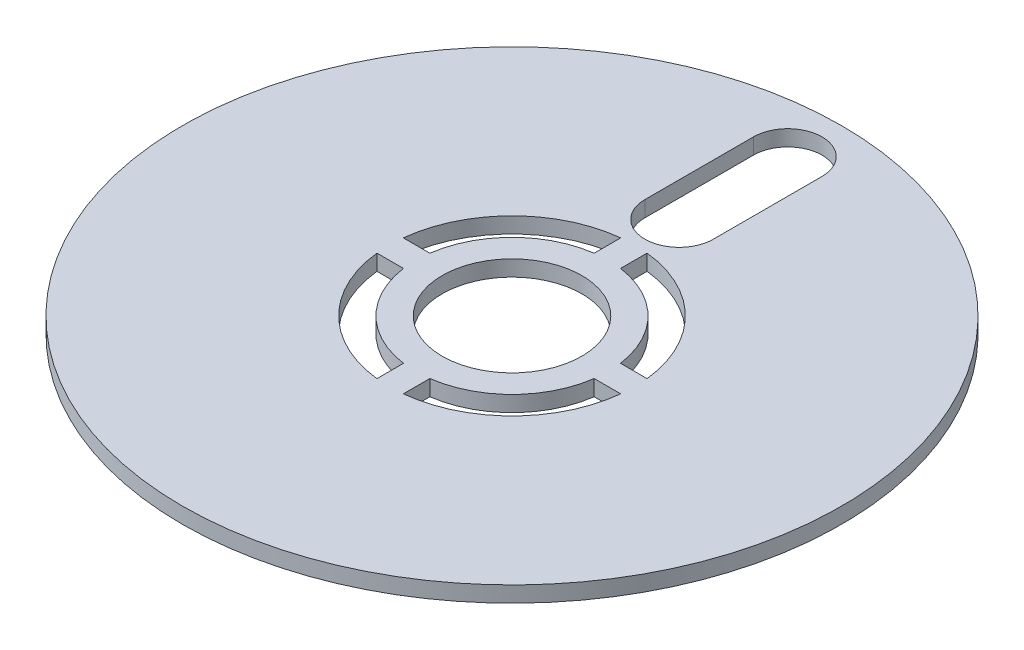
ISO-10303-21;
HEADER;
FILE_DESCRIPTION(('STEP AP214'),'2;1');
FILE_NAME('part.step','',(''),(''),'','','');
FILE_SCHEMA(('AUTOMOTIVE_DESIGN { 1 0 10303 214 1 1 1 1 }'));
ENDSEC;
DATA;
#1=APPLICATION_CONTEXT('core data for automotive mechanical design processes');
#2=APPLICATION_PROTOCOL_DEFINITION('international standard','automotive_design',2000,#1);
#3=PRODUCT_CONTEXT('',#1,'mechanical');
#4=PRODUCT('Part','Part','',(#3));
#5=PRODUCT_RELATED_PRODUCT_CATEGORY('part','',(#4));
#6=PRODUCT_DEFINITION_FORMATION('','',#4);
#7=PRODUCT_DEFINITION_CONTEXT('part definition',#1,'design');
#8=PRODUCT_DEFINITION('design','',#6,#7);
#9=PRODUCT_DEFINITION_SHAPE('','',#8);
#10=(LENGTH_UNIT() NAMED_UNIT(*) SI_UNIT(.MILLI.,.METRE.));
#11=(NAMED_UNIT(*) PLANE_ANGLE_UNIT() SI_UNIT($,.RADIAN.));
#12=(NAMED_UNIT(*) SI_UNIT($,.STERADIAN.) SOLID_ANGLE_UNIT());
#13=UNCERTAINTY_MEASURE_WITH_UNIT(LENGTH_MEASURE(1.E-05),#10,'distance_accuracy_value','');
#14=(GEOMETRIC_REPRESENTATION_CONTEXT(3) GLOBAL_UNCERTAINTY_ASSIGNED_CONTEXT((#13)) GLOBAL_UNIT_ASSIGNED_CONTEXT((#10,
#11,#12)) REPRESENTATION_CONTEXT('',''));
#15=CARTESIAN_POINT('',(0.,0.,0.));
#16=DIRECTION('',(0.,0.,1.));
#17=DIRECTION('',(1.,0.,0.));
#18=AXIS2_PLACEMENT_3D('',#15,#16,#17);
#19=CARTESIAN_POINT('',(0.,3.,0.));
#20=DIRECTION('',(0.,1.,0.));
#21=DIRECTION('',(0.,0.,1.));
#22=AXIS2_PLACEMENT_3D('',#19,#20,#21);
#23=PLANE('',#22);
#24=CARTESIAN_POINT('',(0.,3.,-31.7));
#25=DIRECTION('',(0.,1.,0.));
#26=DIRECTION('',(0.,0.,1.));
#27=AXIS2_PLACEMENT_3D('',#24,#25,#26);
#28=CIRCLE('',#27,6.5);
#29=CARTESIAN_POINT('',(-6.5,3.,-31.7));
#30=VERTEX_POINT('',#29);
#31=CARTESIAN_POINT('',(6.5,3.,-31.7));
#32=VERTEX_POINT('',#31);
#33=EDGE_CURVE('E52',#30,#32,#28,.T.);
#34=ORIENTED_EDGE('',*,*,#33,.F.);
#35=DIRECTION('',(0.,0.,1.));
#36=VECTOR('',#35,1.);
#37=CARTESIAN_POINT('',(-6.5,3.,-31.7));
#38=LINE('',#37,#36);
#39=CARTESIAN_POINT('',(-6.50000000000001,3.,-52.3));
#40=VERTEX_POINT('',#39);
#41=EDGE_CURVE('E192',#40,#30,#38,.T.);
#42=ORIENTED_EDGE('',*,*,#41,.F.);
#43=CARTESIAN_POINT('',(0.,3.,-52.3));
#44=DIRECTION('',(0.,1.,0.));
#45=DIRECTION('',(0.,0.,1.));
#46=AXIS2_PLACEMENT_3D('',#43,#44,#45);
#47=CIRCLE('',#46,6.5);
#48=CARTESIAN_POINT('',(6.5,3.,-52.3));
#49=VERTEX_POINT('',#48);
#50=EDGE_CURVE('E195',#49,#40,#47,.T.);
#51=ORIENTED_EDGE('',*,*,#50,.F.);
#52=DIRECTION('',(0.,0.,-1.));
#53=VECTOR('',#52,1.);
#54=CARTESIAN_POINT('',(6.5,3.,-31.7));
#55=LINE('',#54,#53);
#56=EDGE_CURVE('E201',#32,#49,#55,.T.);
#57=ORIENTED_EDGE('',*,*,#56,.F.);
#58=EDGE_LOOP('',(#34,#42,#51,#57));
#59=FACE_BOUND('',#58,.T.);
#60=CARTESIAN_POINT('',(0.,3.,0.));
#61=DIRECTION('',(0.,1.,0.));
#62=DIRECTION('',(0.,0.,1.));
#63=AXIS2_PLACEMENT_3D('',#60,#61,#62);
#64=CIRCLE('',#63,62.5);
#65=CARTESIAN_POINT('',(0.,3.,62.5));
#66=VERTEX_POINT('',#65);
#67=EDGE_CURVE('E11',#66,#66,#64,.T.);
#68=ORIENTED_EDGE('',*,*,#67,.T.);
#69=EDGE_LOOP('',(#68));
#70=FACE_BOUND('',#69,.T.);
#71=CARTESIAN_POINT('',(0.,3.,0.));
#72=DIRECTION('',(0.,1.,0.));
#73=DIRECTION('',(0.,0.,1.));
#74=AXIS2_PLACEMENT_3D('',#71,#72,#73);
#75=CIRCLE('',#74,13.25);
#76=CARTESIAN_POINT('',(0.,3.,13.25));
#77=VERTEX_POINT('',#76);
#78=EDGE_CURVE('E335',#77,#77,#75,.T.);
#79=ORIENTED_EDGE('',*,*,#78,.F.);
#80=EDGE_LOOP('',(#79));
#81=FACE_BOUND('',#80,.T.);
#82=DIRECTION('',(0.,0.,-1.));
#83=VECTOR('',#82,1.);
#84=CARTESIAN_POINT('',(-2.5,3.,-18.0779561897909));
#85=LINE('',#84,#83);
#86=CARTESIAN_POINT('',(-2.5,3.,-18.0779561897909));
#87=VERTEX_POINT('',#86);
#88=CARTESIAN_POINT('',(-2.5,3.,-23.1152006264276));
#89=VERTEX_POINT('',#88);
#90=EDGE_CURVE('E306',#87,#89,#85,.T.);
#91=ORIENTED_EDGE('',*,*,#90,.F.);
#92=CARTESIAN_POINT('',(0.,3.,0.));
#93=DIRECTION('',(0.,-1.,0.));
#94=DIRECTION('',(0.,0.,1.));
#95=AXIS2_PLACEMENT_3D('',#92,#93,#94);
#96=CIRCLE('',#95,18.25);
#97=CARTESIAN_POINT('',(-18.0779561897909,3.,-2.5));
#98=VERTEX_POINT('',#97);
#99=EDGE_CURVE('E304',#98,#87,#96,.T.);
#100=ORIENTED_EDGE('',*,*,#99,.F.);
#101=DIRECTION('',(1.,0.,0.));
#102=VECTOR('',#101,1.);
#103=CARTESIAN_POINT('',(-18.0779561897909,3.,-2.5));
#104=LINE('',#103,#102);
#105=CARTESIAN_POINT('',(-23.1152006264276,3.,-2.5));
#106=VERTEX_POINT('',#105);
#107=EDGE_CURVE('E312',#106,#98,#104,.T.);
#108=ORIENTED_EDGE('',*,*,#107,.F.);
#109=CARTESIAN_POINT('',(0.,3.,0.));
#110=DIRECTION('',(0.,1.,0.));
#111=DIRECTION('',(0.,0.,1.));
#112=AXIS2_PLACEMENT_3D('',#109,#110,#111);
#113=CIRCLE('',#112,23.25);
#114=EDGE_CURVE('E309',#89,#106,#113,.T.);
#115=ORIENTED_EDGE('',*,*,#114,.F.);
#116=EDGE_LOOP('',(#91,#100,#108,#115));
#117=FACE_BOUND('',#116,.T.);
#118=DIRECTION('',(1.,0.,0.));
#119=VECTOR('',#118,1.);
#120=CARTESIAN_POINT('',(18.0779561897909,3.,-2.5));
#121=LINE('',#120,#119);
#122=CARTESIAN_POINT('',(18.0779561897909,3.,-2.5));
#123=VERTEX_POINT('',#122);
#124=CARTESIAN_POINT('',(23.1152006264276,3.,-2.5));
#125=VERTEX_POINT('',#124);
#126=EDGE_CURVE('E275',#123,#125,#121,.T.);
#127=ORIENTED_EDGE('',*,*,#126,.F.);
#128=CARTESIAN_POINT('',(0.,3.,0.));
#129=DIRECTION('',(0.,-1.,0.));
#130=DIRECTION('',(0.,0.,1.));
#131=AXIS2_PLACEMENT_3D('',#128,#129,#130);
#132=CIRCLE('',#131,18.25);
#133=CARTESIAN_POINT('',(2.5,3.,-18.0779561897909));
#134=VERTEX_POINT('',#133);
#135=EDGE_CURVE('E273',#134,#123,#132,.T.);
#136=ORIENTED_EDGE('',*,*,#135,.F.);
#137=DIRECTION('',(0.,0.,1.));
#138=VECTOR('',#137,1.);
#139=CARTESIAN_POINT('',(2.5,3.,-18.0779561897909));
#140=LINE('',#139,#138);
#141=CARTESIAN_POINT('',(2.5,3.,-23.1152006264276));
#142=VERTEX_POINT('',#141);
#143=EDGE_CURVE('E281',#142,#134,#140,.T.);
#144=ORIENTED_EDGE('',*,*,#143,.F.);
#145=CARTESIAN_POINT('',(0.,3.,0.));
#146=DIRECTION('',(0.,1.,0.));
#147=DIRECTION('',(0.,0.,1.));
#148=AXIS2_PLACEMENT_3D('',#145,#146,#147);
#149=CIRCLE('',#148,23.25);
#150=EDGE_CURVE('E278',#125,#142,#149,.T.);
#151=ORIENTED_EDGE('',*,*,#150,.F.);
#152=EDGE_LOOP('',(#127,#136,#144,#151));
#153=FACE_BOUND('',#152,.T.);
#154=DIRECTION('',(0.,0.,1.));
#155=VECTOR('',#154,1.);
#156=CARTESIAN_POINT('',(2.5,3.,18.0779561897909));
#157=LINE('',#156,#155);
#158=CARTESIAN_POINT('',(2.5,3.,18.0779561897909));
#159=VERTEX_POINT('',#158);
#160=CARTESIAN_POINT('',(2.5,3.,23.1152006264276));
#161=VERTEX_POINT('',#160);
#162=EDGE_CURVE('E244',#159,#161,#157,.T.);
#163=ORIENTED_EDGE('',*,*,#162,.F.);
#164=CARTESIAN_POINT('',(0.,3.,0.));
#165=DIRECTION('',(0.,-1.,0.));
#166=DIRECTION('',(0.,0.,1.));
#167=AXIS2_PLACEMENT_3D('',#164,#165,#166);
#168=CIRCLE('',#167,18.25);
#169=CARTESIAN_POINT('',(18.0779561897909,3.,2.5));
#170=VERTEX_POINT('',#169);
#171=EDGE_CURVE('E242',#170,#159,#168,.T.);
#172=ORIENTED_EDGE('',*,*,#171,.F.);
#173=DIRECTION('',(-1.,0.,0.));
#174=VECTOR('',#173,1.);
#175=CARTESIAN_POINT('',(18.0779561897909,3.,2.5));
#176=LINE('',#175,#174);
#177=CARTESIAN_POINT('',(23.1152006264276,3.,2.5));
#178=VERTEX_POINT('',#177);
#179=EDGE_CURVE('E250',#178,#170,#176,.T.);
#180=ORIENTED_EDGE('',*,*,#179,.F.);
#181=CARTESIAN_POINT('',(0.,3.,0.));
#182=DIRECTION('',(0.,1.,0.));
#183=DIRECTION('',(0.,0.,1.));
#184=AXIS2_PLACEMENT_3D('',#181,#182,#183);
#185=CIRCLE('',#184,23.25);
#186=EDGE_CURVE('E247',#161,#178,#185,.T.);
#187=ORIENTED_EDGE('',*,*,#186,.F.);
#188=EDGE_LOOP('',(#163,#172,#180,#187));
#189=FACE_BOUND('',#188,.T.);
#190=DIRECTION('',(-1.,0.,0.));
#191=VECTOR('',#190,1.);
#192=CARTESIAN_POINT('',(-18.0779561897909,3.,2.5));
#193=LINE('',#192,#191);
#194=CARTESIAN_POINT('',(-18.0779561897909,3.,2.5));
#195=VERTEX_POINT('',#194);
#196=CARTESIAN_POINT('',(-23.1152006264276,3.,2.50000000000001));
#197=VERTEX_POINT('',#196);
#198=EDGE_CURVE('E213',#195,#197,#193,.T.);
#199=ORIENTED_EDGE('',*,*,#198,.F.);
#200=CARTESIAN_POINT('',(0.,3.,0.));
#201=DIRECTION('',(0.,-1.,0.));
#202=DIRECTION('',(0.,0.,1.));
#203=AXIS2_PLACEMENT_3D('',#200,#201,#202);
#204=CIRCLE('',#203,18.25);
#205=CARTESIAN_POINT('',(-2.5,3.,18.0779561897909));
#206=VERTEX_POINT('',#205);
#207=EDGE_CURVE('E211',#206,#195,#204,.T.);
#208=ORIENTED_EDGE('',*,*,#207,.F.);
#209=DIRECTION('',(0.,0.,-1.));
#210=VECTOR('',#209,1.);
#211=CARTESIAN_POINT('',(-2.5,3.,18.0779561897909));
#212=LINE('',#211,#210);
#213=CARTESIAN_POINT('',(-2.5,3.,23.1152006264276));
#214=VERTEX_POINT('',#213);
#215=EDGE_CURVE('E219',#214,#206,#212,.T.);
#216=ORIENTED_EDGE('',*,*,#215,.F.);
#217=CARTESIAN_POINT('',(0.,3.,0.));
#218=DIRECTION('',(0.,1.,0.));
#219=DIRECTION('',(0.,0.,1.));
#220=AXIS2_PLACEMENT_3D('',#217,#218,#219);
#221=CIRCLE('',#220,23.25);
#222=EDGE_CURVE('E216',#197,#214,#221,.T.);
#223=ORIENTED_EDGE('',*,*,#222,.F.);
#224=EDGE_LOOP('',(#199,#208,#216,#223));
#225=FACE_BOUND('',#224,.T.);
#226=ADVANCED_FACE('F37',(#59,#70,#81,#117,#153,#189,#225),#23,.T.);
#227=CARTESIAN_POINT('',(0.,0.,0.));
#228=DIRECTION('',(0.,1.,0.));
#229=DIRECTION('',(0.,0.,1.));
#230=AXIS2_PLACEMENT_3D('',#227,#228,#229);
#231=PLANE('',#230);
#232=DIRECTION('',(0.,0.,1.));
#233=VECTOR('',#232,1.);
#234=CARTESIAN_POINT('',(-6.5,0.,-31.7));
#235=LINE('',#234,#233);
#236=CARTESIAN_POINT('',(-6.50000000000001,0.,-52.3));
#237=VERTEX_POINT('',#236);
#238=CARTESIAN_POINT('',(-6.5,0.,-31.7));
#239=VERTEX_POINT('',#238);
#240=EDGE_CURVE('E182',#237,#239,#235,.T.);
#241=ORIENTED_EDGE('',*,*,#240,.T.);
#242=CARTESIAN_POINT('',(0.,0.,-31.7));
#243=DIRECTION('',(0.,1.,0.));
#244=DIRECTION('',(0.,0.,1.));
#245=AXIS2_PLACEMENT_3D('',#242,#243,#244);
#246=CIRCLE('',#245,6.5);
#247=CARTESIAN_POINT('',(6.5,0.,-31.7));
#248=VERTEX_POINT('',#247);
#249=EDGE_CURVE('E176',#239,#248,#246,.T.);
#250=ORIENTED_EDGE('',*,*,#249,.T.);
#251=DIRECTION('',(0.,0.,-1.));
#252=VECTOR('',#251,1.);
#253=CARTESIAN_POINT('',(6.5,0.,-31.7));
#254=LINE('',#253,#252);
#255=CARTESIAN_POINT('',(6.5,0.,-52.3));
#256=VERTEX_POINT('',#255);
#257=EDGE_CURVE('E185',#248,#256,#254,.T.);
#258=ORIENTED_EDGE('',*,*,#257,.T.);
#259=CARTESIAN_POINT('',(0.,0.,-52.3));
#260=DIRECTION('',(0.,1.,0.));
#261=DIRECTION('',(0.,0.,1.));
#262=AXIS2_PLACEMENT_3D('',#259,#260,#261);
#263=CIRCLE('',#262,6.5);
#264=EDGE_CURVE('E60',#256,#237,#263,.T.);
#265=ORIENTED_EDGE('',*,*,#264,.T.);
#266=EDGE_LOOP('',(#241,#250,#258,#265));
#267=FACE_BOUND('',#266,.T.);
#268=CARTESIAN_POINT('',(0.,0.,0.));
#269=DIRECTION('',(0.,-1.,0.));
#270=DIRECTION('',(0.,0.,1.));
#271=AXIS2_PLACEMENT_3D('',#268,#269,#270);
#272=CIRCLE('',#271,18.25);
#273=CARTESIAN_POINT('',(18.0779561897909,0.,2.5));
#274=VERTEX_POINT('',#273);
#275=CARTESIAN_POINT('',(2.5,0.,18.0779561897909));
#276=VERTEX_POINT('',#275);
#277=EDGE_CURVE('E241',#274,#276,#272,.T.);
#278=ORIENTED_EDGE('',*,*,#277,.T.);
#279=DIRECTION('',(0.,0.,1.));
#280=VECTOR('',#279,1.);
#281=CARTESIAN_POINT('',(2.5,0.,18.0779561897909));
#282=LINE('',#281,#280);
#283=CARTESIAN_POINT('',(2.5,0.,23.1152006264276));
#284=VERTEX_POINT('',#283);
#285=EDGE_CURVE('E255',#276,#284,#282,.T.);
#286=ORIENTED_EDGE('',*,*,#285,.T.);
#287=CARTESIAN_POINT('',(0.,0.,0.));
#288=DIRECTION('',(0.,1.,0.));
#289=DIRECTION('',(0.,0.,1.));
#290=AXIS2_PLACEMENT_3D('',#287,#288,#289);
#291=CIRCLE('',#290,23.25);
#292=CARTESIAN_POINT('',(23.1152006264276,0.,2.5));
#293=VERTEX_POINT('',#292);
#294=EDGE_CURVE('E258',#284,#293,#291,.T.);
#295=ORIENTED_EDGE('',*,*,#294,.T.);
#296=DIRECTION('',(-1.,0.,0.));
#297=VECTOR('',#296,1.);
#298=CARTESIAN_POINT('',(18.0779561897909,0.,2.5));
#299=LINE('',#298,#297);
#300=EDGE_CURVE('E245',#293,#274,#299,.T.);
#301=ORIENTED_EDGE('',*,*,#300,.T.);
#302=EDGE_LOOP('',(#278,#286,#295,#301));
#303=FACE_BOUND('',#302,.T.);
#304=CARTESIAN_POINT('',(0.,0.,0.));
#305=DIRECTION('',(0.,-1.,0.));
#306=DIRECTION('',(0.,0.,1.));
#307=AXIS2_PLACEMENT_3D('',#304,#305,#306);
#308=CIRCLE('',#307,18.25);
#309=CARTESIAN_POINT('',(-18.0779561897909,0.,-2.5));
#310=VERTEX_POINT('',#309);
#311=CARTESIAN_POINT('',(-2.5,0.,-18.0779561897909));
#312=VERTEX_POINT('',#311);
#313=EDGE_CURVE('E303',#310,#312,#308,.T.);
#314=ORIENTED_EDGE('',*,*,#313,.T.);
#315=DIRECTION('',(0.,0.,-1.));
#316=VECTOR('',#315,1.);
#317=CARTESIAN_POINT('',(-2.5,0.,-18.0779561897909));
#318=LINE('',#317,#316);
#319=CARTESIAN_POINT('',(-2.5,0.,-23.1152006264276));
#320=VERTEX_POINT('',#319);
#321=EDGE_CURVE('E317',#312,#320,#318,.T.);
#322=ORIENTED_EDGE('',*,*,#321,.T.);
#323=CARTESIAN_POINT('',(0.,0.,0.));
#324=DIRECTION('',(0.,1.,0.));
#325=DIRECTION('',(0.,0.,1.));
#326=AXIS2_PLACEMENT_3D('',#323,#324,#325);
#327=CIRCLE('',#326,23.25);
#328=CARTESIAN_POINT('',(-23.1152006264276,0.,-2.49999999999999));
#329=VERTEX_POINT('',#328);
#330=EDGE_CURVE('E320',#320,#329,#327,.T.);
#331=ORIENTED_EDGE('',*,*,#330,.T.);
#332=DIRECTION('',(1.,0.,0.));
#333=VECTOR('',#332,1.);
#334=CARTESIAN_POINT('',(-18.0779561897909,0.,-2.5));
#335=LINE('',#334,#333);
#336=EDGE_CURVE('E307',#329,#310,#335,.T.);
#337=ORIENTED_EDGE('',*,*,#336,.T.);
#338=EDGE_LOOP('',(#314,#322,#331,#337));
#339=FACE_BOUND('',#338,.T.);
#340=CARTESIAN_POINT('',(0.,0.,0.));
#341=DIRECTION('',(0.,1.,0.));
#342=DIRECTION('',(0.,0.,1.));
#343=AXIS2_PLACEMENT_3D('',#340,#341,#342);
#344=CIRCLE('',#343,62.5);
#345=CARTESIAN_POINT('',(0.,0.,62.5));
#346=VERTEX_POINT('',#345);
#347=EDGE_CURVE('E41',#346,#346,#344,.T.);
#348=ORIENTED_EDGE('',*,*,#347,.F.);
#349=EDGE_LOOP('',(#348));
#350=FACE_BOUND('',#349,.T.);
#351=CARTESIAN_POINT('',(0.,0.,0.));
#352=DIRECTION('',(0.,1.,0.));
#353=DIRECTION('',(0.,0.,1.));
#354=AXIS2_PLACEMENT_3D('',#351,#352,#353);
#355=CIRCLE('',#354,13.25);
#356=CARTESIAN_POINT('',(0.,0.,13.25));
#357=VERTEX_POINT('',#356);
#358=EDGE_CURVE('E334',#357,#357,#355,.T.);
#359=ORIENTED_EDGE('',*,*,#358,.T.);
#360=EDGE_LOOP('',(#359));
#361=FACE_BOUND('',#360,.T.);
#362=CARTESIAN_POINT('',(0.,0.,0.));
#363=DIRECTION('',(0.,-1.,0.));
#364=DIRECTION('',(0.,0.,1.));
#365=AXIS2_PLACEMENT_3D('',#362,#363,#364);
#366=CIRCLE('',#365,18.25);
#367=CARTESIAN_POINT('',(2.5,0.,-18.0779561897909));
#368=VERTEX_POINT('',#367);
#369=CARTESIAN_POINT('',(18.0779561897909,0.,-2.5));
#370=VERTEX_POINT('',#369);
#371=EDGE_CURVE('E272',#368,#370,#366,.T.);
#372=ORIENTED_EDGE('',*,*,#371,.T.);
#373=DIRECTION('',(1.,0.,0.));
#374=VECTOR('',#373,1.);
#375=CARTESIAN_POINT('',(18.0779561897909,0.,-2.5));
#376=LINE('',#375,#374);
#377=CARTESIAN_POINT('',(23.1152006264276,0.,-2.5));
#378=VERTEX_POINT('',#377);
#379=EDGE_CURVE('E286',#370,#378,#376,.T.);
#380=ORIENTED_EDGE('',*,*,#379,.T.);
#381=CARTESIAN_POINT('',(0.,0.,0.));
#382=DIRECTION('',(0.,1.,0.));
#383=DIRECTION('',(0.,0.,1.));
#384=AXIS2_PLACEMENT_3D('',#381,#382,#383);
#385=CIRCLE('',#384,23.25);
#386=CARTESIAN_POINT('',(2.5,0.,-23.1152006264276));
#387=VERTEX_POINT('',#386);
#388=EDGE_CURVE('E289',#378,#387,#385,.T.);
#389=ORIENTED_EDGE('',*,*,#388,.T.);
#390=DIRECTION('',(0.,0.,1.));
#391=VECTOR('',#390,1.);
#392=CARTESIAN_POINT('',(2.5,0.,-18.0779561897909));
#393=LINE('',#392,#391);
#394=EDGE_CURVE('E276',#387,#368,#393,.T.);
#395=ORIENTED_EDGE('',*,*,#394,.T.);
#396=EDGE_LOOP('',(#372,#380,#389,#395));
#397=FACE_BOUND('',#396,.T.);
#398=CARTESIAN_POINT('',(0.,0.,0.));
#399=DIRECTION('',(0.,-1.,0.));
#400=DIRECTION('',(0.,0.,1.));
#401=AXIS2_PLACEMENT_3D('',#398,#399,#400);
#402=CIRCLE('',#401,18.25);
#403=CARTESIAN_POINT('',(-2.5,0.,18.0779561897909));
#404=VERTEX_POINT('',#403);
#405=CARTESIAN_POINT('',(-18.0779561897909,0.,2.5));
#406=VERTEX_POINT('',#405);
#407=EDGE_CURVE('E207',#404,#406,#402,.T.);
#408=ORIENTED_EDGE('',*,*,#407,.T.);
#409=DIRECTION('',(-1.,0.,0.));
#410=VECTOR('',#409,1.);
#411=CARTESIAN_POINT('',(-18.0779561897909,0.,2.5));
#412=LINE('',#411,#410);
#413=CARTESIAN_POINT('',(-23.1152006264276,0.,2.50000000000001));
#414=VERTEX_POINT('',#413);
#415=EDGE_CURVE('E224',#406,#414,#412,.T.);
#416=ORIENTED_EDGE('',*,*,#415,.T.);
#417=CARTESIAN_POINT('',(0.,0.,0.));
#418=DIRECTION('',(0.,1.,0.));
#419=DIRECTION('',(0.,0.,1.));
#420=AXIS2_PLACEMENT_3D('',#417,#418,#419);
#421=CIRCLE('',#420,23.25);
#422=CARTESIAN_POINT('',(-2.5,0.,23.1152006264276));
#423=VERTEX_POINT('',#422);
#424=EDGE_CURVE('E227',#414,#423,#421,.T.);
#425=ORIENTED_EDGE('',*,*,#424,.T.);
#426=DIRECTION('',(0.,0.,-1.));
#427=VECTOR('',#426,1.);
#428=CARTESIAN_POINT('',(-2.5,0.,18.0779561897909));
#429=LINE('',#428,#427);
#430=EDGE_CURVE('E214',#423,#404,#429,.T.);
#431=ORIENTED_EDGE('',*,*,#430,.T.);
#432=EDGE_LOOP('',(#408,#416,#425,#431));
#433=FACE_BOUND('',#432,.T.);
#434=ADVANCED_FACE('F189',(#267,#303,#339,#350,#361,#397,#433),#231,.F.);
#435=CARTESIAN_POINT('',(0.,3.,0.));
#436=DIRECTION('',(0.,-1.,0.));
#437=DIRECTION('',(0.,0.,-1.));
#438=AXIS2_PLACEMENT_3D('',#435,#436,#437);
#439=CYLINDRICAL_SURFACE('',#438,62.5);
#440=ORIENTED_EDGE('',*,*,#67,.F.);
#441=EDGE_LOOP('',(#440));
#442=FACE_BOUND('',#441,.T.);
#443=ORIENTED_EDGE('',*,*,#347,.T.);
#444=EDGE_LOOP('',(#443));
#445=FACE_BOUND('',#444,.T.);
#446=ADVANCED_FACE('F39',(#442,#445),#439,.T.);
#447=CARTESIAN_POINT('',(0.,3.,0.));
#448=DIRECTION('',(0.,-1.,0.));
#449=DIRECTION('',(0.,0.,-1.));
#450=AXIS2_PLACEMENT_3D('',#447,#448,#449);
#451=CYLINDRICAL_SURFACE('',#450,13.25);
#452=ORIENTED_EDGE('',*,*,#78,.T.);
#453=EDGE_LOOP('',(#452));
#454=FACE_BOUND('',#453,.T.);
#455=ORIENTED_EDGE('',*,*,#358,.F.);
#456=EDGE_LOOP('',(#455));
#457=FACE_BOUND('',#456,.T.);
#458=ADVANCED_FACE('F343',(#454,#457),#451,.F.);
#459=CARTESIAN_POINT('',(0.,3.,0.));
#460=DIRECTION('',(0.,-1.,0.));
#461=DIRECTION('',(0.,0.,-1.));
#462=AXIS2_PLACEMENT_3D('',#459,#460,#461);
#463=CYLINDRICAL_SURFACE('',#462,18.25);
#464=ORIENTED_EDGE('',*,*,#313,.F.);
#465=DIRECTION('',(0.,-1.,0.));
#466=VECTOR('',#465,1.);
#467=CARTESIAN_POINT('',(-18.0779561897909,3.,-2.5));
#468=LINE('',#467,#466);
#469=EDGE_CURVE('E314',#98,#310,#468,.T.);
#470=ORIENTED_EDGE('',*,*,#469,.F.);
#471=ORIENTED_EDGE('',*,*,#99,.T.);
#472=DIRECTION('',(0.,-1.,0.));
#473=VECTOR('',#472,1.);
#474=CARTESIAN_POINT('',(-2.5,3.,-18.0779561897909));
#475=LINE('',#474,#473);
#476=EDGE_CURVE('E331',#87,#312,#475,.T.);
#477=ORIENTED_EDGE('',*,*,#476,.T.);
#478=EDGE_LOOP('',(#464,#470,#471,#477));
#479=FACE_BOUND('',#478,.T.);
#480=ADVANCED_FACE('F345',(#479),#463,.T.);
#481=CARTESIAN_POINT('',(-2.5,3.,-18.0779561897909));
#482=DIRECTION('',(-1.,0.,0.));
#483=DIRECTION('',(0.,0.,1.));
#484=AXIS2_PLACEMENT_3D('',#481,#482,#483);
#485=PLANE('',#484);
#486=ORIENTED_EDGE('',*,*,#321,.F.);
#487=ORIENTED_EDGE('',*,*,#476,.F.);
#488=ORIENTED_EDGE('',*,*,#90,.T.);
#489=DIRECTION('',(0.,-1.,0.));
#490=VECTOR('',#489,1.);
#491=CARTESIAN_POINT('',(-2.5,3.,-23.1152006264276));
#492=LINE('',#491,#490);
#493=EDGE_CURVE('E329',#89,#320,#492,.T.);
#494=ORIENTED_EDGE('',*,*,#493,.T.);
#495=EDGE_LOOP('',(#486,#487,#488,#494));
#496=FACE_BOUND('',#495,.T.);
#497=ADVANCED_FACE('F352',(#496),#485,.T.);
#498=CARTESIAN_POINT('',(0.,3.,0.));
#499=DIRECTION('',(0.,-1.,0.));
#500=DIRECTION('',(0.,0.,-1.));
#501=AXIS2_PLACEMENT_3D('',#498,#499,#500);
#502=CYLINDRICAL_SURFACE('',#501,23.25);
#503=ORIENTED_EDGE('',*,*,#330,.F.);
#504=ORIENTED_EDGE('',*,*,#493,.F.);
#505=ORIENTED_EDGE('',*,*,#114,.T.);
#506=DIRECTION('',(0.,-1.,0.));
#507=VECTOR('',#506,1.);
#508=CARTESIAN_POINT('',(-23.1152006264276,3.,-2.49999999999999));
#509=LINE('',#508,#507);
#510=EDGE_CURVE('E327',#106,#329,#509,.T.);
#511=ORIENTED_EDGE('',*,*,#510,.T.);
#512=EDGE_LOOP('',(#503,#504,#505,#511));
#513=FACE_BOUND('',#512,.T.);
#514=ADVANCED_FACE('F448',(#513),#502,.F.);
#515=CARTESIAN_POINT('',(-18.0779561897909,3.,-2.5));
#516=DIRECTION('',(0.,0.,-1.));
#517=DIRECTION('',(-1.,0.,0.));
#518=AXIS2_PLACEMENT_3D('',#515,#516,#517);
#519=PLANE('',#518);
#520=ORIENTED_EDGE('',*,*,#336,.F.);
#521=ORIENTED_EDGE('',*,*,#510,.F.);
#522=ORIENTED_EDGE('',*,*,#107,.T.);
#523=ORIENTED_EDGE('',*,*,#469,.T.);
#524=EDGE_LOOP('',(#520,#521,#522,#523));
#525=FACE_BOUND('',#524,.T.);
#526=ADVANCED_FACE('F444',(#525),#519,.T.);
#527=CARTESIAN_POINT('',(0.,3.,0.));
#528=DIRECTION('',(0.,-1.,0.));
#529=DIRECTION('',(0.,0.,-1.));
#530=AXIS2_PLACEMENT_3D('',#527,#528,#529);
#531=CYLINDRICAL_SURFACE('',#530,18.25);
#532=ORIENTED_EDGE('',*,*,#371,.F.);
#533=DIRECTION('',(0.,-1.,0.));
#534=VECTOR('',#533,1.);
#535=CARTESIAN_POINT('',(2.5,3.,-18.0779561897909));
#536=LINE('',#535,#534);
#537=EDGE_CURVE('E283',#134,#368,#536,.T.);
#538=ORIENTED_EDGE('',*,*,#537,.F.);
#539=ORIENTED_EDGE('',*,*,#135,.T.);
#540=DIRECTION('',(0.,-1.,0.));
#541=VECTOR('',#540,1.);
#542=CARTESIAN_POINT('',(18.0779561897909,3.,-2.5));
#543=LINE('',#542,#541);
#544=EDGE_CURVE('E300',#123,#370,#543,.T.);
#545=ORIENTED_EDGE('',*,*,#544,.T.);
#546=EDGE_LOOP('',(#532,#538,#539,#545));
#547=FACE_BOUND('',#546,.T.);
#548=ADVANCED_FACE('F440',(#547),#531,.T.);
#549=CARTESIAN_POINT('',(18.0779561897909,3.,-2.5));
#550=DIRECTION('',(0.,0.,-1.));
#551=DIRECTION('',(-1.,0.,0.));
#552=AXIS2_PLACEMENT_3D('',#549,#550,#551);
#553=PLANE('',#552);
#554=ORIENTED_EDGE('',*,*,#379,.F.);
#555=ORIENTED_EDGE('',*,*,#544,.F.);
#556=ORIENTED_EDGE('',*,*,#126,.T.);
#557=DIRECTION('',(0.,-1.,0.));
#558=VECTOR('',#557,1.);
#559=CARTESIAN_POINT('',(23.1152006264276,3.,-2.5));
#560=LINE('',#559,#558);
#561=EDGE_CURVE('E298',#125,#378,#560,.T.);
#562=ORIENTED_EDGE('',*,*,#561,.T.);
#563=EDGE_LOOP('',(#554,#555,#556,#562));
#564=FACE_BOUND('',#563,.T.);
#565=ADVANCED_FACE('F436',(#564),#553,.T.);
#566=CARTESIAN_POINT('',(0.,3.,0.));
#567=DIRECTION('',(0.,-1.,0.));
#568=DIRECTION('',(0.,0.,-1.));
#569=AXIS2_PLACEMENT_3D('',#566,#567,#568);
#570=CYLINDRICAL_SURFACE('',#569,23.25);
#571=ORIENTED_EDGE('',*,*,#388,.F.);
#572=ORIENTED_EDGE('',*,*,#561,.F.);
#573=ORIENTED_EDGE('',*,*,#150,.T.);
#574=DIRECTION('',(0.,-1.,0.));
#575=VECTOR('',#574,1.);
#576=CARTESIAN_POINT('',(2.5,3.,-23.1152006264276));
#577=LINE('',#576,#575);
#578=EDGE_CURVE('E296',#142,#387,#577,.T.);
#579=ORIENTED_EDGE('',*,*,#578,.T.);
#580=EDGE_LOOP('',(#571,#572,#573,#579));
#581=FACE_BOUND('',#580,.T.);
#582=ADVANCED_FACE('F432',(#581),#570,.F.);
#583=CARTESIAN_POINT('',(2.5,3.,-18.0779561897909));
#584=DIRECTION('',(1.,0.,0.));
#585=DIRECTION('',(0.,0.,-1.));
#586=AXIS2_PLACEMENT_3D('',#583,#584,#585);
#587=PLANE('',#586);
#588=ORIENTED_EDGE('',*,*,#394,.F.);
#589=ORIENTED_EDGE('',*,*,#578,.F.);
#590=ORIENTED_EDGE('',*,*,#143,.T.);
#591=ORIENTED_EDGE('',*,*,#537,.T.);
#592=EDGE_LOOP('',(#588,#589,#590,#591));
#593=FACE_BOUND('',#592,.T.);
#594=ADVANCED_FACE('F428',(#593),#587,.T.);
#595=CARTESIAN_POINT('',(0.,3.,0.));
#596=DIRECTION('',(0.,-1.,0.));
#597=DIRECTION('',(0.,0.,-1.));
#598=AXIS2_PLACEMENT_3D('',#595,#596,#597);
#599=CYLINDRICAL_SURFACE('',#598,18.25);
#600=ORIENTED_EDGE('',*,*,#277,.F.);
#601=DIRECTION('',(0.,-1.,0.));
#602=VECTOR('',#601,1.);
#603=CARTESIAN_POINT('',(18.0779561897909,3.,2.5));
#604=LINE('',#603,#602);
#605=EDGE_CURVE('E252',#170,#274,#604,.T.);
#606=ORIENTED_EDGE('',*,*,#605,.F.);
#607=ORIENTED_EDGE('',*,*,#171,.T.);
#608=DIRECTION('',(0.,-1.,0.));
#609=VECTOR('',#608,1.);
#610=CARTESIAN_POINT('',(2.5,3.,18.0779561897909));
#611=LINE('',#610,#609);
#612=EDGE_CURVE('E269',#159,#276,#611,.T.);
#613=ORIENTED_EDGE('',*,*,#612,.T.);
#614=EDGE_LOOP('',(#600,#606,#607,#613));
#615=FACE_BOUND('',#614,.T.);
#616=ADVANCED_FACE('F424',(#615),#599,.T.);
#617=CARTESIAN_POINT('',(2.5,3.,18.0779561897909));
#618=DIRECTION('',(1.,0.,0.));
#619=DIRECTION('',(0.,0.,-1.));
#620=AXIS2_PLACEMENT_3D('',#617,#618,#619);
#621=PLANE('',#620);
#622=ORIENTED_EDGE('',*,*,#285,.F.);
#623=ORIENTED_EDGE('',*,*,#612,.F.);
#624=ORIENTED_EDGE('',*,*,#162,.T.);
#625=DIRECTION('',(0.,-1.,0.));
#626=VECTOR('',#625,1.);
#627=CARTESIAN_POINT('',(2.5,3.,23.1152006264276));
#628=LINE('',#627,#626);
#629=EDGE_CURVE('E267',#161,#284,#628,.T.);
#630=ORIENTED_EDGE('',*,*,#629,.T.);
#631=EDGE_LOOP('',(#622,#623,#624,#630));
#632=FACE_BOUND('',#631,.T.);
#633=ADVANCED_FACE('F420',(#632),#621,.T.);
#634=CARTESIAN_POINT('',(0.,3.,0.));
#635=DIRECTION('',(0.,-1.,0.));
#636=DIRECTION('',(0.,0.,-1.));
#637=AXIS2_PLACEMENT_3D('',#634,#635,#636);
#638=CYLINDRICAL_SURFACE('',#637,23.25);
#639=ORIENTED_EDGE('',*,*,#294,.F.);
#640=ORIENTED_EDGE('',*,*,#629,.F.);
#641=ORIENTED_EDGE('',*,*,#186,.T.);
#642=DIRECTION('',(0.,-1.,0.));
#643=VECTOR('',#642,1.);
#644=CARTESIAN_POINT('',(23.1152006264276,3.,2.5));
#645=LINE('',#644,#643);
#646=EDGE_CURVE('E265',#178,#293,#645,.T.);
#647=ORIENTED_EDGE('',*,*,#646,.T.);
#648=EDGE_LOOP('',(#639,#640,#641,#647));
#649=FACE_BOUND('',#648,.T.);
#650=ADVANCED_FACE('F416',(#649),#638,.F.);
#651=CARTESIAN_POINT('',(18.0779561897909,3.,2.5));
#652=DIRECTION('',(0.,0.,1.));
#653=DIRECTION('',(1.,0.,0.));
#654=AXIS2_PLACEMENT_3D('',#651,#652,#653);
#655=PLANE('',#654);
#656=ORIENTED_EDGE('',*,*,#300,.F.);
#657=ORIENTED_EDGE('',*,*,#646,.F.);
#658=ORIENTED_EDGE('',*,*,#179,.T.);
#659=ORIENTED_EDGE('',*,*,#605,.T.);
#660=EDGE_LOOP('',(#656,#657,#658,#659));
#661=FACE_BOUND('',#660,.T.);
#662=ADVANCED_FACE('F413',(#661),#655,.T.);
#663=CARTESIAN_POINT('',(0.,3.,0.));
#664=DIRECTION('',(0.,-1.,0.));
#665=DIRECTION('',(0.,0.,-1.));
#666=AXIS2_PLACEMENT_3D('',#663,#664,#665);
#667=CYLINDRICAL_SURFACE('',#666,18.25);
#668=ORIENTED_EDGE('',*,*,#407,.F.);
#669=DIRECTION('',(0.,-1.,0.));
#670=VECTOR('',#669,1.);
#671=CARTESIAN_POINT('',(-2.5,3.,18.0779561897909));
#672=LINE('',#671,#670);
#673=EDGE_CURVE('E221',#206,#404,#672,.T.);
#674=ORIENTED_EDGE('',*,*,#673,.F.);
#675=ORIENTED_EDGE('',*,*,#207,.T.);
#676=DIRECTION('',(0.,-1.,0.));
#677=VECTOR('',#676,1.);
#678=CARTESIAN_POINT('',(-18.0779561897909,3.,2.5));
#679=LINE('',#678,#677);
#680=EDGE_CURVE('E238',#195,#406,#679,.T.);
#681=ORIENTED_EDGE('',*,*,#680,.T.);
#682=EDGE_LOOP('',(#668,#674,#675,#681));
#683=FACE_BOUND('',#682,.T.);
#684=ADVANCED_FACE('F394',(#683),#667,.T.);
#685=CARTESIAN_POINT('',(-18.0779561897909,3.,2.5));
#686=DIRECTION('',(0.,0.,1.));
#687=DIRECTION('',(1.,0.,0.));
#688=AXIS2_PLACEMENT_3D('',#685,#686,#687);
#689=PLANE('',#688);
#690=ORIENTED_EDGE('',*,*,#415,.F.);
#691=ORIENTED_EDGE('',*,*,#680,.F.);
#692=ORIENTED_EDGE('',*,*,#198,.T.);
#693=DIRECTION('',(0.,-1.,0.));
#694=VECTOR('',#693,1.);
#695=CARTESIAN_POINT('',(-23.1152006264276,3.,2.50000000000001));
#696=LINE('',#695,#694);
#697=EDGE_CURVE('E236',#197,#414,#696,.T.);
#698=ORIENTED_EDGE('',*,*,#697,.T.);
#699=EDGE_LOOP('',(#690,#691,#692,#698));
#700=FACE_BOUND('',#699,.T.);
#701=ADVANCED_FACE('F387',(#700),#689,.T.);
#702=CARTESIAN_POINT('',(0.,3.,0.));
#703=DIRECTION('',(0.,-1.,0.));
#704=DIRECTION('',(0.,0.,-1.));
#705=AXIS2_PLACEMENT_3D('',#702,#703,#704);
#706=CYLINDRICAL_SURFACE('',#705,23.25);
#707=ORIENTED_EDGE('',*,*,#424,.F.);
#708=ORIENTED_EDGE('',*,*,#697,.F.);
#709=ORIENTED_EDGE('',*,*,#222,.T.);
#710=DIRECTION('',(0.,-1.,0.));
#711=VECTOR('',#710,1.);
#712=CARTESIAN_POINT('',(-2.5,3.,23.1152006264276));
#713=LINE('',#712,#711);
#714=EDGE_CURVE('E234',#214,#423,#713,.T.);
#715=ORIENTED_EDGE('',*,*,#714,.T.);
#716=EDGE_LOOP('',(#707,#708,#709,#715));
#717=FACE_BOUND('',#716,.T.);
#718=ADVANCED_FACE('F390',(#717),#706,.F.);
#719=CARTESIAN_POINT('',(-2.5,3.,18.0779561897909));
#720=DIRECTION('',(-1.,0.,0.));
#721=DIRECTION('',(0.,0.,1.));
#722=AXIS2_PLACEMENT_3D('',#719,#720,#721);
#723=PLANE('',#722);
#724=ORIENTED_EDGE('',*,*,#430,.F.);
#725=ORIENTED_EDGE('',*,*,#714,.F.);
#726=ORIENTED_EDGE('',*,*,#215,.T.);
#727=ORIENTED_EDGE('',*,*,#673,.T.);
#728=EDGE_LOOP('',(#724,#725,#726,#727));
#729=FACE_BOUND('',#728,.T.);
#730=ADVANCED_FACE('F397',(#729),#723,.T.);
#731=CARTESIAN_POINT('',(0.,0.,-31.7));
#732=DIRECTION('',(0.,1.,0.));
#733=DIRECTION('',(0.,0.,1.));
#734=AXIS2_PLACEMENT_3D('',#731,#732,#733);
#735=CYLINDRICAL_SURFACE('',#734,6.5);
#736=ORIENTED_EDGE('',*,*,#33,.T.);
#737=DIRECTION('',(0.,1.,0.));
#738=VECTOR('',#737,1.);
#739=CARTESIAN_POINT('',(6.5,0.,-31.7));
#740=LINE('',#739,#738);
#741=EDGE_CURVE('E172',#248,#32,#740,.T.);
#742=ORIENTED_EDGE('',*,*,#741,.F.);
#743=ORIENTED_EDGE('',*,*,#249,.F.);
#744=DIRECTION('',(0.,1.,0.));
#745=VECTOR('',#744,1.);
#746=CARTESIAN_POINT('',(-6.5,0.,-31.7));
#747=LINE('',#746,#745);
#748=EDGE_CURVE('E205',#239,#30,#747,.T.);
#749=ORIENTED_EDGE('',*,*,#748,.T.);
#750=EDGE_LOOP('',(#736,#742,#743,#749));
#751=FACE_BOUND('',#750,.T.);
#752=ADVANCED_FACE('F174',(#751),#735,.F.);
#753=CARTESIAN_POINT('',(-6.5,0.,-31.7));
#754=DIRECTION('',(-1.,0.,0.));
#755=DIRECTION('',(0.,0.,1.));
#756=AXIS2_PLACEMENT_3D('',#753,#754,#755);
#757=PLANE('',#756);
#758=ORIENTED_EDGE('',*,*,#41,.T.);
#759=ORIENTED_EDGE('',*,*,#748,.F.);
#760=ORIENTED_EDGE('',*,*,#240,.F.);
#761=DIRECTION('',(0.,1.,0.));
#762=VECTOR('',#761,1.);
#763=CARTESIAN_POINT('',(-6.50000000000001,0.,-52.3));
#764=LINE('',#763,#762);
#765=EDGE_CURVE('E208',#237,#40,#764,.T.);
#766=ORIENTED_EDGE('',*,*,#765,.T.);
#767=EDGE_LOOP('',(#758,#759,#760,#766));
#768=FACE_BOUND('',#767,.T.);
#769=ADVANCED_FACE('F404',(#768),#757,.F.);
#770=CARTESIAN_POINT('',(0.,0.,-52.3));
#771=DIRECTION('',(0.,1.,0.));
#772=DIRECTION('',(0.,0.,1.));
#773=AXIS2_PLACEMENT_3D('',#770,#771,#772);
#774=CYLINDRICAL_SURFACE('',#773,6.5);
#775=ORIENTED_EDGE('',*,*,#50,.T.);
#776=ORIENTED_EDGE('',*,*,#765,.F.);
#777=ORIENTED_EDGE('',*,*,#264,.F.);
#778=DIRECTION('',(0.,1.,0.));
#779=VECTOR('',#778,1.);
#780=CARTESIAN_POINT('',(6.5,0.,-52.3));
#781=LINE('',#780,#779);
#782=EDGE_CURVE('E181',#256,#49,#781,.T.);
#783=ORIENTED_EDGE('',*,*,#782,.T.);
#784=EDGE_LOOP('',(#775,#776,#777,#783));
#785=FACE_BOUND('',#784,.T.);
#786=ADVANCED_FACE('F552',(#785),#774,.F.);
#787=CARTESIAN_POINT('',(6.5,0.,-31.7));
#788=DIRECTION('',(1.,0.,0.));
#789=DIRECTION('',(0.,0.,-1.));
#790=AXIS2_PLACEMENT_3D('',#787,#788,#789);
#791=PLANE('',#790);
#792=ORIENTED_EDGE('',*,*,#56,.T.);
#793=ORIENTED_EDGE('',*,*,#782,.F.);
#794=ORIENTED_EDGE('',*,*,#257,.F.);
#795=ORIENTED_EDGE('',*,*,#741,.T.);
#796=EDGE_LOOP('',(#792,#793,#794,#795));
#797=FACE_BOUND('',#796,.T.);
#798=ADVANCED_FACE('F186',(#797),#791,.F.);
#799=CLOSED_SHELL('',(#226,#434,#446,#458,#480,#497,#514,#526,#548,#565,#582,#594,#616,#633,
#650,#662,#684,#701,#718,#730,#752,#769,#786,#798));
#800=MANIFOLD_SOLID_BREP('B2',#799);
#801=ADVANCED_BREP_SHAPE_REPRESENTATION('',(#18,#800),#14);
#802=SHAPE_DEFINITION_REPRESENTATION(#9,#801);
ENDSEC;
END-ISO-10303-21;
